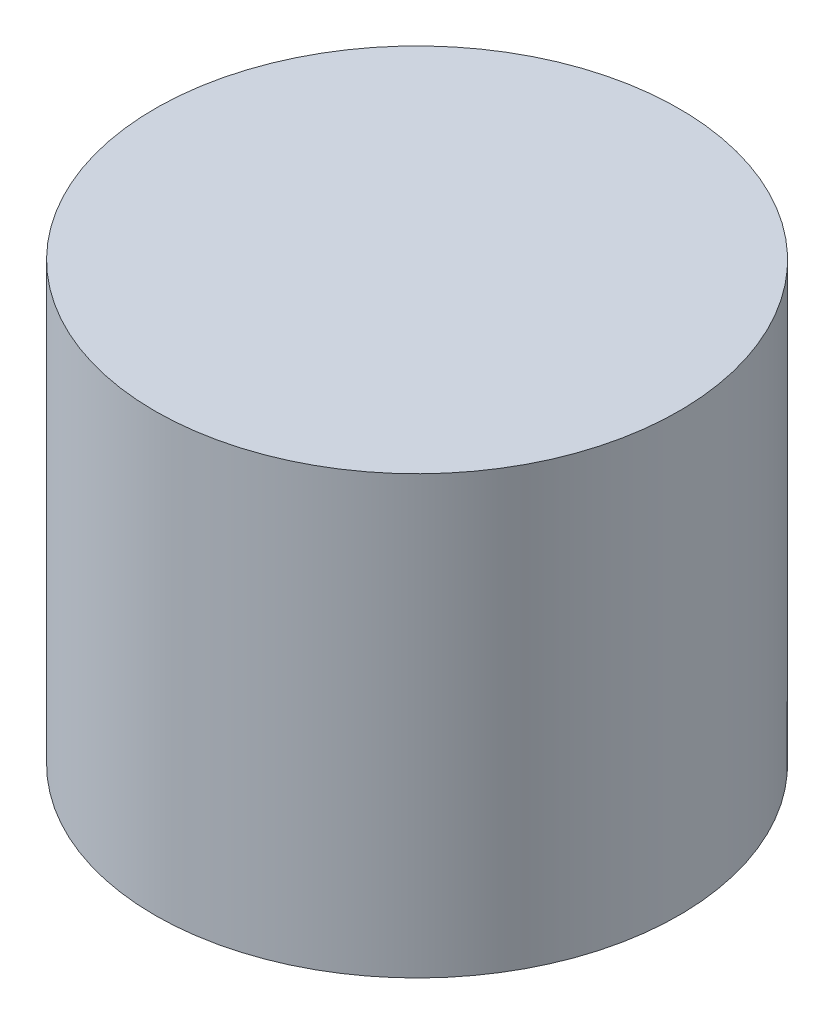
ISO-10303-21;
HEADER;
FILE_DESCRIPTION(('STEP AP214'),'2;1');
FILE_NAME('part.step','',(''),(''),'','','');
FILE_SCHEMA(('AUTOMOTIVE_DESIGN { 1 0 10303 214 1 1 1 1 }'));
ENDSEC;
DATA;
#1=APPLICATION_CONTEXT('core data for automotive mechanical design processes');
#2=APPLICATION_PROTOCOL_DEFINITION('international standard','automotive_design',2000,#1);
#3=PRODUCT_CONTEXT('',#1,'mechanical');
#4=PRODUCT('Part','Part','',(#3));
#5=PRODUCT_RELATED_PRODUCT_CATEGORY('part','',(#4));
#6=PRODUCT_DEFINITION_FORMATION('','',#4);
#7=PRODUCT_DEFINITION_CONTEXT('part definition',#1,'design');
#8=PRODUCT_DEFINITION('design','',#6,#7);
#9=PRODUCT_DEFINITION_SHAPE('','',#8);
#10=(LENGTH_UNIT() NAMED_UNIT(*) SI_UNIT(.MILLI.,.METRE.));
#11=(NAMED_UNIT(*) PLANE_ANGLE_UNIT() SI_UNIT($,.RADIAN.));
#12=(NAMED_UNIT(*) SI_UNIT($,.STERADIAN.) SOLID_ANGLE_UNIT());
#13=UNCERTAINTY_MEASURE_WITH_UNIT(LENGTH_MEASURE(1.E-05),#10,'distance_accuracy_value','');
#14=(GEOMETRIC_REPRESENTATION_CONTEXT(3) GLOBAL_UNCERTAINTY_ASSIGNED_CONTEXT((#13)) GLOBAL_UNIT_ASSIGNED_CONTEXT((#10,
#11,#12)) REPRESENTATION_CONTEXT('',''));
#15=CARTESIAN_POINT('',(0.,0.,0.));
#16=DIRECTION('',(0.,0.,1.));
#17=DIRECTION('',(1.,0.,0.));
#18=AXIS2_PLACEMENT_3D('',#15,#16,#17);
#19=CARTESIAN_POINT('',(0.,150.,0.));
#20=DIRECTION('',(0.,-1.,0.));
#21=DIRECTION('',(0.,0.,-1.));
#22=AXIS2_PLACEMENT_3D('',#19,#20,#21);
#23=CYLINDRICAL_SURFACE('',#22,90.);
#24=CARTESIAN_POINT('',(0.,150.,0.));
#25=DIRECTION('',(0.,1.,0.));
#26=DIRECTION('',(0.,0.,1.));
#27=AXIS2_PLACEMENT_3D('',#24,#25,#26);
#28=CIRCLE('',#27,90.);
#29=CARTESIAN_POINT('',(0.,150.,90.));
#30=VERTEX_POINT('',#29);
#31=EDGE_CURVE('E10',#30,#30,#28,.T.);
#32=ORIENTED_EDGE('',*,*,#31,.F.);
#33=EDGE_LOOP('',(#32));
#34=FACE_BOUND('',#33,.T.);
#35=CARTESIAN_POINT('',(0.,0.,0.));
#36=DIRECTION('',(0.,1.,0.));
#37=DIRECTION('',(0.,0.,1.));
#38=AXIS2_PLACEMENT_3D('',#35,#36,#37);
#39=CIRCLE('',#38,90.);
#40=CARTESIAN_POINT('',(0.,0.,90.));
#41=VERTEX_POINT('',#40);
#42=EDGE_CURVE('E35',#41,#41,#39,.T.);
#43=ORIENTED_EDGE('',*,*,#42,.T.);
#44=EDGE_LOOP('',(#43));
#45=FACE_BOUND('',#44,.T.);
#46=ADVANCED_FACE('F32',(#34,#45),#23,.T.);
#47=CARTESIAN_POINT('',(0.,150.,0.));
#48=DIRECTION('',(0.,1.,0.));
#49=DIRECTION('',(0.,0.,1.));
#50=AXIS2_PLACEMENT_3D('',#47,#48,#49);
#51=PLANE('',#50);
#52=ORIENTED_EDGE('',*,*,#31,.T.);
#53=EDGE_LOOP('',(#52));
#54=FACE_BOUND('',#53,.T.);
#55=ADVANCED_FACE('F47',(#54),#51,.T.);
#56=CARTESIAN_POINT('',(0.,0.,0.));
#57=DIRECTION('',(0.,1.,0.));
#58=DIRECTION('',(0.,0.,1.));
#59=AXIS2_PLACEMENT_3D('',#56,#57,#58);
#60=PLANE('',#59);
#61=ORIENTED_EDGE('',*,*,#42,.F.);
#62=EDGE_LOOP('',(#61));
#63=FACE_BOUND('',#62,.T.);
#64=ADVANCED_FACE('F45',(#63),#60,.F.);
#65=CLOSED_SHELL('',(#46,#55,#64));
#66=MANIFOLD_SOLID_BREP('B2',#65);
#67=ADVANCED_BREP_SHAPE_REPRESENTATION('',(#18,#66),#14);
#68=SHAPE_DEFINITION_REPRESENTATION(#9,#67);
ENDSEC;
END-ISO-10303-21;
